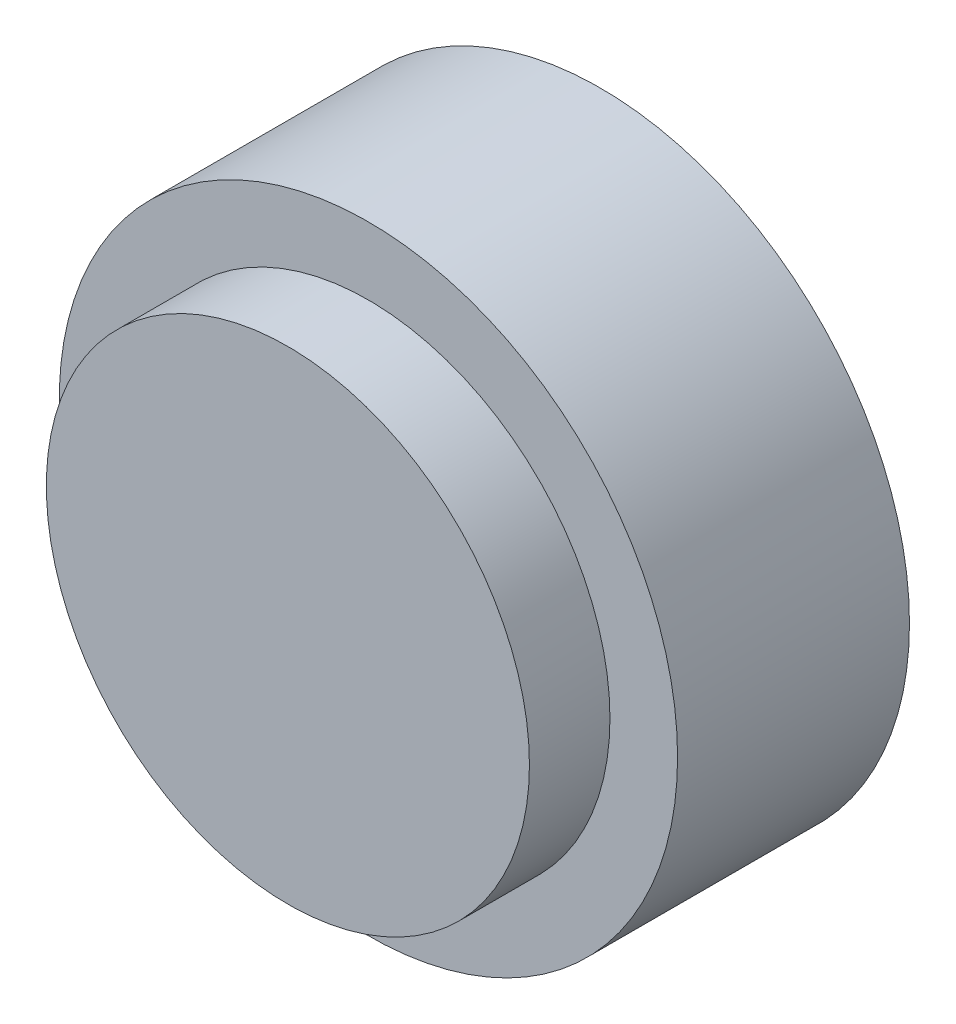
ISO-10303-21;
HEADER;
FILE_DESCRIPTION(('STEP AP214'),'2;1');
FILE_NAME('part.step','',(''),(''),'','','');
FILE_SCHEMA(('AUTOMOTIVE_DESIGN { 1 0 10303 214 1 1 1 1 }'));
ENDSEC;
DATA;
#1=APPLICATION_CONTEXT('core data for automotive mechanical design processes');
#2=APPLICATION_PROTOCOL_DEFINITION('international standard','automotive_design',2000,#1);
#3=PRODUCT_CONTEXT('',#1,'mechanical');
#4=PRODUCT('Part','Part','',(#3));
#5=PRODUCT_RELATED_PRODUCT_CATEGORY('part','',(#4));
#6=PRODUCT_DEFINITION_FORMATION('','',#4);
#7=PRODUCT_DEFINITION_CONTEXT('part definition',#1,'design');
#8=PRODUCT_DEFINITION('design','',#6,#7);
#9=PRODUCT_DEFINITION_SHAPE('','',#8);
#10=(LENGTH_UNIT() NAMED_UNIT(*) SI_UNIT(.MILLI.,.METRE.));
#11=(NAMED_UNIT(*) PLANE_ANGLE_UNIT() SI_UNIT($,.RADIAN.));
#12=(NAMED_UNIT(*) SI_UNIT($,.STERADIAN.) SOLID_ANGLE_UNIT());
#13=UNCERTAINTY_MEASURE_WITH_UNIT(LENGTH_MEASURE(1.E-05),#10,'distance_accuracy_value','');
#14=(GEOMETRIC_REPRESENTATION_CONTEXT(3) GLOBAL_UNCERTAINTY_ASSIGNED_CONTEXT((#13)) GLOBAL_UNIT_ASSIGNED_CONTEXT((#10,
#11,#12)) REPRESENTATION_CONTEXT('',''));
#15=CARTESIAN_POINT('',(0.,0.,0.));
#16=DIRECTION('',(0.,0.,1.));
#17=DIRECTION('',(1.,0.,0.));
#18=AXIS2_PLACEMENT_3D('',#15,#16,#17);
#19=CARTESIAN_POINT('',(0.,0.,12.5));
#20=DIRECTION('',(0.,0.,-1.));
#21=DIRECTION('',(-1.,0.,0.));
#22=AXIS2_PLACEMENT_3D('',#19,#20,#21);
#23=CYLINDRICAL_SURFACE('',#22,37.5);
#24=CARTESIAN_POINT('',(0.,0.,12.5));
#25=DIRECTION('',(0.,0.,1.));
#26=DIRECTION('',(1.,0.,0.));
#27=AXIS2_PLACEMENT_3D('',#24,#25,#26);
#28=CIRCLE('',#27,37.5);
#29=CARTESIAN_POINT('',(37.5,0.,12.5));
#30=VERTEX_POINT('',#29);
#31=EDGE_CURVE('E47',#30,#30,#28,.T.);
#32=ORIENTED_EDGE('',*,*,#31,.F.);
#33=EDGE_LOOP('',(#32));
#34=FACE_BOUND('',#33,.T.);
#35=CARTESIAN_POINT('',(0.,0.,0.));
#36=DIRECTION('',(0.,0.,1.));
#37=DIRECTION('',(1.,0.,0.));
#38=AXIS2_PLACEMENT_3D('',#35,#36,#37);
#39=CIRCLE('',#38,37.5);
#40=CARTESIAN_POINT('',(37.5,0.,0.));
#41=VERTEX_POINT('',#40);
#42=EDGE_CURVE('E159',#41,#41,#39,.T.);
#43=ORIENTED_EDGE('',*,*,#42,.T.);
#44=EDGE_LOOP('',(#43));
#45=FACE_BOUND('',#44,.T.);
#46=ADVANCED_FACE('F40',(#34,#45),#23,.T.);
#47=CARTESIAN_POINT('',(0.,0.,12.5));
#48=DIRECTION('',(0.,0.,1.));
#49=DIRECTION('',(1.,0.,0.));
#50=AXIS2_PLACEMENT_3D('',#47,#48,#49);
#51=PLANE('',#50);
#52=ORIENTED_EDGE('',*,*,#31,.T.);
#53=EDGE_LOOP('',(#52));
#54=FACE_BOUND('',#53,.T.);
#55=ADVANCED_FACE('F166',(#54),#51,.T.);
#56=CARTESIAN_POINT('',(0.,0.,-36.));
#57=DIRECTION('',(0.,0.,1.));
#58=DIRECTION('',(1.,0.,0.));
#59=AXIS2_PLACEMENT_3D('',#56,#57,#58);
#60=CYLINDRICAL_SURFACE('',#59,48.);
#61=CARTESIAN_POINT('',(0.,0.,-36.));
#62=DIRECTION('',(0.,0.,1.));
#63=DIRECTION('',(1.,0.,0.));
#64=AXIS2_PLACEMENT_3D('',#61,#62,#63);
#65=CIRCLE('',#64,48.);
#66=CARTESIAN_POINT('',(48.,0.,-36.));
#67=VERTEX_POINT('',#66);
#68=EDGE_CURVE('E153',#67,#67,#65,.T.);
#69=ORIENTED_EDGE('',*,*,#68,.T.);
#70=EDGE_LOOP('',(#69));
#71=FACE_BOUND('',#70,.T.);
#72=CARTESIAN_POINT('',(0.,0.,0.));
#73=DIRECTION('',(0.,0.,1.));
#74=DIRECTION('',(1.,0.,0.));
#75=AXIS2_PLACEMENT_3D('',#72,#73,#74);
#76=CIRCLE('',#75,48.);
#77=CARTESIAN_POINT('',(48.,0.,0.));
#78=VERTEX_POINT('',#77);
#79=EDGE_CURVE('E152',#78,#78,#76,.T.);
#80=ORIENTED_EDGE('',*,*,#79,.F.);
#81=EDGE_LOOP('',(#80));
#82=FACE_BOUND('',#81,.T.);
#83=ADVANCED_FACE('F180',(#71,#82),#60,.T.);
#84=CARTESIAN_POINT('',(0.,0.,-36.));
#85=DIRECTION('',(0.,0.,1.));
#86=DIRECTION('',(1.,0.,0.));
#87=AXIS2_PLACEMENT_3D('',#84,#85,#86);
#88=CYLINDRICAL_SURFACE('',#87,21.);
#89=CARTESIAN_POINT('',(0.,0.,-36.));
#90=DIRECTION('',(0.,0.,1.));
#91=DIRECTION('',(1.,0.,0.));
#92=AXIS2_PLACEMENT_3D('',#89,#90,#91);
#93=CIRCLE('',#92,21.);
#94=CARTESIAN_POINT('',(21.,0.,-36.));
#95=VERTEX_POINT('',#94);
#96=EDGE_CURVE('E156',#95,#95,#93,.T.);
#97=ORIENTED_EDGE('',*,*,#96,.F.);
#98=EDGE_LOOP('',(#97));
#99=FACE_BOUND('',#98,.T.);
#100=CARTESIAN_POINT('',(0.,0.,0.));
#101=DIRECTION('',(0.,0.,1.));
#102=DIRECTION('',(1.,0.,0.));
#103=AXIS2_PLACEMENT_3D('',#100,#101,#102);
#104=CIRCLE('',#103,21.);
#105=CARTESIAN_POINT('',(21.,0.,0.));
#106=VERTEX_POINT('',#105);
#107=EDGE_CURVE('E11',#106,#106,#104,.T.);
#108=ORIENTED_EDGE('',*,*,#107,.T.);
#109=EDGE_LOOP('',(#108));
#110=FACE_BOUND('',#109,.T.);
#111=ADVANCED_FACE('F182',(#99,#110),#88,.F.);
#112=CARTESIAN_POINT('',(0.,0.,-36.));
#113=DIRECTION('',(0.,0.,1.));
#114=DIRECTION('',(1.,0.,0.));
#115=AXIS2_PLACEMENT_3D('',#112,#113,#114);
#116=PLANE('',#115);
#117=CARTESIAN_POINT('',(0.,42.,-36.));
#118=DIRECTION('',(0.,0.,-1.));
#119=DIRECTION('',(-1.,0.,0.));
#120=AXIS2_PLACEMENT_3D('',#117,#118,#119);
#121=CIRCLE('',#120,2.025);
#122=CARTESIAN_POINT('',(-2.025,42.,-36.));
#123=VERTEX_POINT('',#122);
#124=EDGE_CURVE('E89',#123,#123,#121,.T.);
#125=ORIENTED_EDGE('',*,*,#124,.F.);
#126=EDGE_LOOP('',(#125));
#127=FACE_BOUND('',#126,.T.);
#128=CARTESIAN_POINT('',(-29.6984848098355,29.6984848098363,-36.));
#129=DIRECTION('',(0.,0.,-1.));
#130=DIRECTION('',(-1.,0.,0.));
#131=AXIS2_PLACEMENT_3D('',#128,#129,#130);
#132=CIRCLE('',#131,2.025);
#133=CARTESIAN_POINT('',(-31.7234848098355,29.6984848098363,-36.));
#134=VERTEX_POINT('',#133);
#135=EDGE_CURVE('E82',#134,#134,#132,.T.);
#136=ORIENTED_EDGE('',*,*,#135,.F.);
#137=EDGE_LOOP('',(#136));
#138=FACE_BOUND('',#137,.T.);
#139=CARTESIAN_POINT('',(-42.0000000000018,1.78285241928082E-12,-36.));
#140=DIRECTION('',(0.,0.,-1.));
#141=DIRECTION('',(-1.,0.,0.));
#142=AXIS2_PLACEMENT_3D('',#139,#140,#141);
#143=CIRCLE('',#142,2.025);
#144=CARTESIAN_POINT('',(-44.0250000000018,1.78285241928082E-12,-36.));
#145=VERTEX_POINT('',#144);
#146=EDGE_CURVE('E98',#145,#145,#143,.T.);
#147=ORIENTED_EDGE('',*,*,#146,.F.);
#148=EDGE_LOOP('',(#147));
#149=FACE_BOUND('',#148,.T.);
#150=CARTESIAN_POINT('',(-29.698484809838,-29.6984848098337,-36.));
#151=DIRECTION('',(0.,0.,-1.));
#152=DIRECTION('',(-1.,0.,0.));
#153=AXIS2_PLACEMENT_3D('',#150,#151,#152);
#154=CIRCLE('',#153,2.025);
#155=CARTESIAN_POINT('',(-31.723484809838,-29.6984848098337,-36.));
#156=VERTEX_POINT('',#155);
#157=EDGE_CURVE('E107',#156,#156,#154,.T.);
#158=ORIENTED_EDGE('',*,*,#157,.F.);
#159=EDGE_LOOP('',(#158));
#160=FACE_BOUND('',#159,.T.);
#161=CARTESIAN_POINT('',(-3.56570483856165E-12,-42.,-36.));
#162=DIRECTION('',(0.,0.,-1.));
#163=DIRECTION('',(-1.,0.,0.));
#164=AXIS2_PLACEMENT_3D('',#161,#162,#163);
#165=CIRCLE('',#164,2.025);
#166=CARTESIAN_POINT('',(-2.02500000000357,-42.,-36.));
#167=VERTEX_POINT('',#166);
#168=EDGE_CURVE('E116',#167,#167,#165,.T.);
#169=ORIENTED_EDGE('',*,*,#168,.F.);
#170=EDGE_LOOP('',(#169));
#171=FACE_BOUND('',#170,.T.);
#172=CARTESIAN_POINT('',(29.698484809832,-29.6984848098363,-36.));
#173=DIRECTION('',(0.,0.,-1.));
#174=DIRECTION('',(-1.,0.,0.));
#175=AXIS2_PLACEMENT_3D('',#172,#173,#174);
#176=CIRCLE('',#175,2.025);
#177=CARTESIAN_POINT('',(27.673484809832,-29.6984848098363,-36.));
#178=VERTEX_POINT('',#177);
#179=EDGE_CURVE('E125',#178,#178,#176,.T.);
#180=ORIENTED_EDGE('',*,*,#179,.F.);
#181=EDGE_LOOP('',(#180));
#182=FACE_BOUND('',#181,.T.);
#183=CARTESIAN_POINT('',(41.9999999999982,-1.78799593583724E-12,-36.));
#184=DIRECTION('',(0.,0.,-1.));
#185=DIRECTION('',(-1.,0.,0.));
#186=AXIS2_PLACEMENT_3D('',#183,#184,#185);
#187=CIRCLE('',#186,2.025);
#188=CARTESIAN_POINT('',(39.9749999999982,-1.78799593583724E-12,-36.));
#189=VERTEX_POINT('',#188);
#190=EDGE_CURVE('E134',#189,#189,#187,.T.);
#191=ORIENTED_EDGE('',*,*,#190,.F.);
#192=EDGE_LOOP('',(#191));
#193=FACE_BOUND('',#192,.T.);
#194=CARTESIAN_POINT('',(29.6984848098345,29.6984848098337,-36.));
#195=DIRECTION('',(0.,0.,-1.));
#196=DIRECTION('',(-1.,0.,0.));
#197=AXIS2_PLACEMENT_3D('',#194,#195,#196);
#198=CIRCLE('',#197,2.025);
#199=CARTESIAN_POINT('',(27.6734848098345,29.6984848098337,-36.));
#200=VERTEX_POINT('',#199);
#201=EDGE_CURVE('E143',#200,#200,#198,.T.);
#202=ORIENTED_EDGE('',*,*,#201,.F.);
#203=EDGE_LOOP('',(#202));
#204=FACE_BOUND('',#203,.T.);
#205=ORIENTED_EDGE('',*,*,#68,.F.);
#206=EDGE_LOOP('',(#205));
#207=FACE_BOUND('',#206,.T.);
#208=ORIENTED_EDGE('',*,*,#96,.T.);
#209=EDGE_LOOP('',(#208));
#210=FACE_BOUND('',#209,.T.);
#211=ADVANCED_FACE('F176',(#127,#138,#149,#160,#171,#182,#193,#204,#207,#210),#116,.F.);
#212=CARTESIAN_POINT('',(0.,0.,0.));
#213=DIRECTION('',(0.,0.,1.));
#214=DIRECTION('',(1.,0.,0.));
#215=AXIS2_PLACEMENT_3D('',#212,#213,#214);
#216=PLANE('',#215);
#217=ORIENTED_EDGE('',*,*,#42,.F.);
#218=EDGE_LOOP('',(#217));
#219=FACE_BOUND('',#218,.T.);
#220=ORIENTED_EDGE('',*,*,#79,.T.);
#221=EDGE_LOOP('',(#220));
#222=FACE_BOUND('',#221,.T.);
#223=ADVANCED_FACE('F172',(#219,#222),#216,.T.);
#224=CARTESIAN_POINT('',(0.,0.,0.));
#225=DIRECTION('',(0.,0.,1.));
#226=DIRECTION('',(1.,0.,0.));
#227=AXIS2_PLACEMENT_3D('',#224,#225,#226);
#228=PLANE('',#227);
#229=ORIENTED_EDGE('',*,*,#107,.F.);
#230=EDGE_LOOP('',(#229));
#231=FACE_BOUND('',#230,.T.);
#232=ADVANCED_FACE('F175',(#231),#228,.F.);
#233=CARTESIAN_POINT('',(29.6984848098345,29.6984848098337,-28.));
#234=DIRECTION('',(0.,0.,-1.));
#235=DIRECTION('',(-1.,0.,0.));
#236=AXIS2_PLACEMENT_3D('',#233,#234,#235);
#237=CONICAL_SURFACE('',#236,1.65,1.02974425867665);
#238=CARTESIAN_POINT('',(29.6984848098345,29.6984848098337,-27.0085799786045));
#239=VERTEX_POINT('',#238);
#240=VERTEX_LOOP('',#239);
#241=FACE_BOUND('',#240,.T.);
#242=CARTESIAN_POINT('',(29.6984848098345,29.6984848098337,-28.));
#243=DIRECTION('',(0.,0.,-1.));
#244=DIRECTION('',(-1.,0.,0.));
#245=AXIS2_PLACEMENT_3D('',#242,#243,#244);
#246=CIRCLE('',#245,1.65);
#247=CARTESIAN_POINT('',(28.0484848098345,29.6984848098337,-28.));
#248=VERTEX_POINT('',#247);
#249=EDGE_CURVE('E149',#248,#248,#246,.T.);
#250=ORIENTED_EDGE('',*,*,#249,.T.);
#251=EDGE_LOOP('',(#250));
#252=FACE_BOUND('',#251,.T.);
#253=ADVANCED_FACE('F193',(#241,#252),#237,.F.);
#254=CARTESIAN_POINT('',(29.6984848098345,29.6984848098337,-36.));
#255=DIRECTION('',(0.,0.,-1.));
#256=DIRECTION('',(-1.,0.,0.));
#257=AXIS2_PLACEMENT_3D('',#254,#255,#256);
#258=CYLINDRICAL_SURFACE('',#257,1.65);
#259=ORIENTED_EDGE('',*,*,#249,.F.);
#260=EDGE_LOOP('',(#259));
#261=FACE_BOUND('',#260,.T.);
#262=CARTESIAN_POINT('',(29.6984848098345,29.6984848098337,-35.625));
#263=DIRECTION('',(0.,0.,-1.));
#264=DIRECTION('',(-1.,0.,0.));
#265=AXIS2_PLACEMENT_3D('',#262,#263,#264);
#266=CIRCLE('',#265,1.65);
#267=CARTESIAN_POINT('',(28.0484848098345,29.6984848098337,-35.625));
#268=VERTEX_POINT('',#267);
#269=EDGE_CURVE('E146',#268,#268,#266,.T.);
#270=ORIENTED_EDGE('',*,*,#269,.T.);
#271=EDGE_LOOP('',(#270));
#272=FACE_BOUND('',#271,.T.);
#273=ADVANCED_FACE('F198',(#261,#272),#258,.F.);
#274=CARTESIAN_POINT('',(29.6984848098345,29.6984848098337,-36.));
#275=DIRECTION('',(0.,0.,-1.));
#276=DIRECTION('',(-1.,0.,0.));
#277=AXIS2_PLACEMENT_3D('',#274,#275,#276);
#278=CONICAL_SURFACE('',#277,2.025,0.785398163397458);
#279=ORIENTED_EDGE('',*,*,#269,.F.);
#280=EDGE_LOOP('',(#279));
#281=FACE_BOUND('',#280,.T.);
#282=ORIENTED_EDGE('',*,*,#201,.T.);
#283=EDGE_LOOP('',(#282));
#284=FACE_BOUND('',#283,.T.);
#285=ADVANCED_FACE('F205',(#281,#284),#278,.F.);
#286=CARTESIAN_POINT('',(41.9999999999982,-1.78799593583724E-12,-28.));
#287=DIRECTION('',(0.,0.,-1.));
#288=DIRECTION('',(-1.,0.,0.));
#289=AXIS2_PLACEMENT_3D('',#286,#287,#288);
#290=CONICAL_SURFACE('',#289,1.65,1.02974425867665);
#291=CARTESIAN_POINT('',(41.9999999999982,-1.78799593583724E-12,-27.0085799786045));
#292=VERTEX_POINT('',#291);
#293=VERTEX_LOOP('',#292);
#294=FACE_BOUND('',#293,.T.);
#295=CARTESIAN_POINT('',(41.9999999999982,-1.78799593583724E-12,-28.));
#296=DIRECTION('',(0.,0.,-1.));
#297=DIRECTION('',(-1.,0.,0.));
#298=AXIS2_PLACEMENT_3D('',#295,#296,#297);
#299=CIRCLE('',#298,1.65);
#300=CARTESIAN_POINT('',(40.3499999999982,-1.78799593583724E-12,-28.));
#301=VERTEX_POINT('',#300);
#302=EDGE_CURVE('E140',#301,#301,#299,.T.);
#303=ORIENTED_EDGE('',*,*,#302,.T.);
#304=EDGE_LOOP('',(#303));
#305=FACE_BOUND('',#304,.T.);
#306=ADVANCED_FACE('F237',(#294,#305),#290,.F.);
#307=CARTESIAN_POINT('',(41.9999999999982,-1.78799593583724E-12,-36.));
#308=DIRECTION('',(0.,0.,-1.));
#309=DIRECTION('',(-1.,0.,0.));
#310=AXIS2_PLACEMENT_3D('',#307,#308,#309);
#311=CYLINDRICAL_SURFACE('',#310,1.65);
#312=ORIENTED_EDGE('',*,*,#302,.F.);
#313=EDGE_LOOP('',(#312));
#314=FACE_BOUND('',#313,.T.);
#315=CARTESIAN_POINT('',(41.9999999999982,-1.78799593583724E-12,-35.625));
#316=DIRECTION('',(0.,0.,-1.));
#317=DIRECTION('',(-1.,0.,0.));
#318=AXIS2_PLACEMENT_3D('',#315,#316,#317);
#319=CIRCLE('',#318,1.65);
#320=CARTESIAN_POINT('',(40.3499999999982,-1.78799593583724E-12,-35.625));
#321=VERTEX_POINT('',#320);
#322=EDGE_CURVE('E137',#321,#321,#319,.T.);
#323=ORIENTED_EDGE('',*,*,#322,.T.);
#324=EDGE_LOOP('',(#323));
#325=FACE_BOUND('',#324,.T.);
#326=ADVANCED_FACE('F242',(#314,#325),#311,.F.);
#327=CARTESIAN_POINT('',(41.9999999999982,-1.78799593583724E-12,-36.));
#328=DIRECTION('',(0.,0.,-1.));
#329=DIRECTION('',(-1.,0.,0.));
#330=AXIS2_PLACEMENT_3D('',#327,#328,#329);
#331=CONICAL_SURFACE('',#330,2.025,0.785398163397448);
#332=ORIENTED_EDGE('',*,*,#322,.F.);
#333=EDGE_LOOP('',(#332));
#334=FACE_BOUND('',#333,.T.);
#335=ORIENTED_EDGE('',*,*,#190,.T.);
#336=EDGE_LOOP('',(#335));
#337=FACE_BOUND('',#336,.T.);
#338=ADVANCED_FACE('F248',(#334,#337),#331,.F.);
#339=CARTESIAN_POINT('',(29.698484809832,-29.6984848098363,-28.));
#340=DIRECTION('',(0.,0.,-1.));
#341=DIRECTION('',(-1.,0.,0.));
#342=AXIS2_PLACEMENT_3D('',#339,#340,#341);
#343=CONICAL_SURFACE('',#342,1.65,1.02974425867665);
#344=CARTESIAN_POINT('',(29.698484809832,-29.6984848098363,-27.0085799786045));
#345=VERTEX_POINT('',#344);
#346=VERTEX_LOOP('',#345);
#347=FACE_BOUND('',#346,.T.);
#348=CARTESIAN_POINT('',(29.698484809832,-29.6984848098363,-28.));
#349=DIRECTION('',(0.,0.,-1.));
#350=DIRECTION('',(-1.,0.,0.));
#351=AXIS2_PLACEMENT_3D('',#348,#349,#350);
#352=CIRCLE('',#351,1.65);
#353=CARTESIAN_POINT('',(28.048484809832,-29.6984848098363,-28.));
#354=VERTEX_POINT('',#353);
#355=EDGE_CURVE('E131',#354,#354,#352,.T.);
#356=ORIENTED_EDGE('',*,*,#355,.T.);
#357=EDGE_LOOP('',(#356));
#358=FACE_BOUND('',#357,.T.);
#359=ADVANCED_FACE('F252',(#347,#358),#343,.F.);
#360=CARTESIAN_POINT('',(29.698484809832,-29.6984848098363,-36.));
#361=DIRECTION('',(0.,0.,-1.));
#362=DIRECTION('',(-1.,0.,0.));
#363=AXIS2_PLACEMENT_3D('',#360,#361,#362);
#364=CYLINDRICAL_SURFACE('',#363,1.65);
#365=ORIENTED_EDGE('',*,*,#355,.F.);
#366=EDGE_LOOP('',(#365));
#367=FACE_BOUND('',#366,.T.);
#368=CARTESIAN_POINT('',(29.698484809832,-29.6984848098363,-35.625));
#369=DIRECTION('',(0.,0.,-1.));
#370=DIRECTION('',(-1.,0.,0.));
#371=AXIS2_PLACEMENT_3D('',#368,#369,#370);
#372=CIRCLE('',#371,1.65);
#373=CARTESIAN_POINT('',(28.048484809832,-29.6984848098363,-35.625));
#374=VERTEX_POINT('',#373);
#375=EDGE_CURVE('E128',#374,#374,#372,.T.);
#376=ORIENTED_EDGE('',*,*,#375,.T.);
#377=EDGE_LOOP('',(#376));
#378=FACE_BOUND('',#377,.T.);
#379=ADVANCED_FACE('F256',(#367,#378),#364,.F.);
#380=CARTESIAN_POINT('',(29.698484809832,-29.6984848098363,-36.));
#381=DIRECTION('',(0.,0.,-1.));
#382=DIRECTION('',(-1.,0.,0.));
#383=AXIS2_PLACEMENT_3D('',#380,#381,#382);
#384=CONICAL_SURFACE('',#383,2.025,0.785398163397448);
#385=ORIENTED_EDGE('',*,*,#375,.F.);
#386=EDGE_LOOP('',(#385));
#387=FACE_BOUND('',#386,.T.);
#388=ORIENTED_EDGE('',*,*,#179,.T.);
#389=EDGE_LOOP('',(#388));
#390=FACE_BOUND('',#389,.T.);
#391=ADVANCED_FACE('F260',(#387,#390),#384,.F.);
#392=CARTESIAN_POINT('',(-3.56570483856165E-12,-42.,-28.));
#393=DIRECTION('',(0.,0.,-1.));
#394=DIRECTION('',(-1.,0.,0.));
#395=AXIS2_PLACEMENT_3D('',#392,#393,#394);
#396=CONICAL_SURFACE('',#395,1.65,1.02974425867665);
#397=CARTESIAN_POINT('',(-3.56790710131145E-12,-42.,-27.0085799786045));
#398=VERTEX_POINT('',#397);
#399=VERTEX_LOOP('',#398);
#400=FACE_BOUND('',#399,.T.);
#401=CARTESIAN_POINT('',(-3.56570483856165E-12,-42.,-28.));
#402=DIRECTION('',(0.,0.,-1.));
#403=DIRECTION('',(-1.,0.,0.));
#404=AXIS2_PLACEMENT_3D('',#401,#402,#403);
#405=CIRCLE('',#404,1.65);
#406=CARTESIAN_POINT('',(-1.65000000000356,-42.,-28.));
#407=VERTEX_POINT('',#406);
#408=EDGE_CURVE('E122',#407,#407,#405,.T.);
#409=ORIENTED_EDGE('',*,*,#408,.T.);
#410=EDGE_LOOP('',(#409));
#411=FACE_BOUND('',#410,.T.);
#412=ADVANCED_FACE('F264',(#400,#411),#396,.F.);
#413=CARTESIAN_POINT('',(-3.56570483856165E-12,-42.,-36.));
#414=DIRECTION('',(0.,0.,-1.));
#415=DIRECTION('',(-1.,0.,0.));
#416=AXIS2_PLACEMENT_3D('',#413,#414,#415);
#417=CYLINDRICAL_SURFACE('',#416,1.65);
#418=ORIENTED_EDGE('',*,*,#408,.F.);
#419=EDGE_LOOP('',(#418));
#420=FACE_BOUND('',#419,.T.);
#421=CARTESIAN_POINT('',(-3.56570483856165E-12,-42.,-35.625));
#422=DIRECTION('',(0.,0.,-1.));
#423=DIRECTION('',(-1.,0.,0.));
#424=AXIS2_PLACEMENT_3D('',#421,#422,#423);
#425=CIRCLE('',#424,1.65);
#426=CARTESIAN_POINT('',(-1.65000000000356,-42.,-35.625));
#427=VERTEX_POINT('',#426);
#428=EDGE_CURVE('E119',#427,#427,#425,.T.);
#429=ORIENTED_EDGE('',*,*,#428,.T.);
#430=EDGE_LOOP('',(#429));
#431=FACE_BOUND('',#430,.T.);
#432=ADVANCED_FACE('F268',(#420,#431),#417,.F.);
#433=CARTESIAN_POINT('',(-3.56570483856165E-12,-42.,-36.));
#434=DIRECTION('',(0.,0.,-1.));
#435=DIRECTION('',(-1.,0.,0.));
#436=AXIS2_PLACEMENT_3D('',#433,#434,#435);
#437=CONICAL_SURFACE('',#436,2.025,0.78539816339745);
#438=ORIENTED_EDGE('',*,*,#428,.F.);
#439=EDGE_LOOP('',(#438));
#440=FACE_BOUND('',#439,.T.);
#441=ORIENTED_EDGE('',*,*,#168,.T.);
#442=EDGE_LOOP('',(#441));
#443=FACE_BOUND('',#442,.T.);
#444=ADVANCED_FACE('F272',(#440,#443),#437,.F.);
#445=CARTESIAN_POINT('',(-29.698484809838,-29.6984848098337,-28.));
#446=DIRECTION('',(0.,0.,-1.));
#447=DIRECTION('',(-1.,0.,0.));
#448=AXIS2_PLACEMENT_3D('',#445,#446,#447);
#449=CONICAL_SURFACE('',#448,1.65,1.02974425867665);
#450=CARTESIAN_POINT('',(-29.698484809838,-29.6984848098337,-27.0085799786045));
#451=VERTEX_POINT('',#450);
#452=VERTEX_LOOP('',#451);
#453=FACE_BOUND('',#452,.T.);
#454=CARTESIAN_POINT('',(-29.698484809838,-29.6984848098337,-28.));
#455=DIRECTION('',(0.,0.,-1.));
#456=DIRECTION('',(-1.,0.,0.));
#457=AXIS2_PLACEMENT_3D('',#454,#455,#456);
#458=CIRCLE('',#457,1.65);
#459=CARTESIAN_POINT('',(-31.348484809838,-29.6984848098337,-28.));
#460=VERTEX_POINT('',#459);
#461=EDGE_CURVE('E113',#460,#460,#458,.T.);
#462=ORIENTED_EDGE('',*,*,#461,.T.);
#463=EDGE_LOOP('',(#462));
#464=FACE_BOUND('',#463,.T.);
#465=ADVANCED_FACE('F276',(#453,#464),#449,.F.);
#466=CARTESIAN_POINT('',(-29.698484809838,-29.6984848098337,-36.));
#467=DIRECTION('',(0.,0.,-1.));
#468=DIRECTION('',(-1.,0.,0.));
#469=AXIS2_PLACEMENT_3D('',#466,#467,#468);
#470=CYLINDRICAL_SURFACE('',#469,1.65);
#471=ORIENTED_EDGE('',*,*,#461,.F.);
#472=EDGE_LOOP('',(#471));
#473=FACE_BOUND('',#472,.T.);
#474=CARTESIAN_POINT('',(-29.698484809838,-29.6984848098337,-35.625));
#475=DIRECTION('',(0.,0.,-1.));
#476=DIRECTION('',(-1.,0.,0.));
#477=AXIS2_PLACEMENT_3D('',#474,#475,#476);
#478=CIRCLE('',#477,1.65);
#479=CARTESIAN_POINT('',(-31.348484809838,-29.6984848098337,-35.625));
#480=VERTEX_POINT('',#479);
#481=EDGE_CURVE('E110',#480,#480,#478,.T.);
#482=ORIENTED_EDGE('',*,*,#481,.T.);
#483=EDGE_LOOP('',(#482));
#484=FACE_BOUND('',#483,.T.);
#485=ADVANCED_FACE('F280',(#473,#484),#470,.F.);
#486=CARTESIAN_POINT('',(-29.698484809838,-29.6984848098337,-36.));
#487=DIRECTION('',(0.,0.,-1.));
#488=DIRECTION('',(-1.,0.,0.));
#489=AXIS2_PLACEMENT_3D('',#486,#487,#488);
#490=CONICAL_SURFACE('',#489,2.025,0.785398163397448);
#491=ORIENTED_EDGE('',*,*,#481,.F.);
#492=EDGE_LOOP('',(#491));
#493=FACE_BOUND('',#492,.T.);
#494=ORIENTED_EDGE('',*,*,#157,.T.);
#495=EDGE_LOOP('',(#494));
#496=FACE_BOUND('',#495,.T.);
#497=ADVANCED_FACE('F284',(#493,#496),#490,.F.);
#498=CARTESIAN_POINT('',(-42.0000000000018,1.78285241928082E-12,-28.));
#499=DIRECTION('',(0.,0.,-1.));
#500=DIRECTION('',(-1.,0.,0.));
#501=AXIS2_PLACEMENT_3D('',#498,#499,#500);
#502=CONICAL_SURFACE('',#501,1.65,1.02974425867665);
#503=CARTESIAN_POINT('',(-42.0000000000018,1.78285241928082E-12,-27.0085799786045));
#504=VERTEX_POINT('',#503);
#505=VERTEX_LOOP('',#504);
#506=FACE_BOUND('',#505,.T.);
#507=CARTESIAN_POINT('',(-42.0000000000018,1.78285241928082E-12,-28.));
#508=DIRECTION('',(0.,0.,-1.));
#509=DIRECTION('',(-1.,0.,0.));
#510=AXIS2_PLACEMENT_3D('',#507,#508,#509);
#511=CIRCLE('',#510,1.65);
#512=CARTESIAN_POINT('',(-43.6500000000018,1.78285241928082E-12,-28.));
#513=VERTEX_POINT('',#512);
#514=EDGE_CURVE('E104',#513,#513,#511,.T.);
#515=ORIENTED_EDGE('',*,*,#514,.T.);
#516=EDGE_LOOP('',(#515));
#517=FACE_BOUND('',#516,.T.);
#518=ADVANCED_FACE('F288',(#506,#517),#502,.F.);
#519=CARTESIAN_POINT('',(-42.0000000000018,1.78285241928082E-12,-36.));
#520=DIRECTION('',(0.,0.,-1.));
#521=DIRECTION('',(-1.,0.,0.));
#522=AXIS2_PLACEMENT_3D('',#519,#520,#521);
#523=CYLINDRICAL_SURFACE('',#522,1.65);
#524=ORIENTED_EDGE('',*,*,#514,.F.);
#525=EDGE_LOOP('',(#524));
#526=FACE_BOUND('',#525,.T.);
#527=CARTESIAN_POINT('',(-42.0000000000018,1.78285241928082E-12,-35.625));
#528=DIRECTION('',(0.,0.,-1.));
#529=DIRECTION('',(-1.,0.,0.));
#530=AXIS2_PLACEMENT_3D('',#527,#528,#529);
#531=CIRCLE('',#530,1.65);
#532=CARTESIAN_POINT('',(-43.6500000000018,1.78285241928082E-12,-35.625));
#533=VERTEX_POINT('',#532);
#534=EDGE_CURVE('E101',#533,#533,#531,.T.);
#535=ORIENTED_EDGE('',*,*,#534,.T.);
#536=EDGE_LOOP('',(#535));
#537=FACE_BOUND('',#536,.T.);
#538=ADVANCED_FACE('F292',(#526,#537),#523,.F.);
#539=CARTESIAN_POINT('',(-42.0000000000018,1.78285241928082E-12,-36.));
#540=DIRECTION('',(0.,0.,-1.));
#541=DIRECTION('',(-1.,0.,0.));
#542=AXIS2_PLACEMENT_3D('',#539,#540,#541);
#543=CONICAL_SURFACE('',#542,2.025,0.785398163397448);
#544=ORIENTED_EDGE('',*,*,#534,.F.);
#545=EDGE_LOOP('',(#544));
#546=FACE_BOUND('',#545,.T.);
#547=ORIENTED_EDGE('',*,*,#146,.T.);
#548=EDGE_LOOP('',(#547));
#549=FACE_BOUND('',#548,.T.);
#550=ADVANCED_FACE('F296',(#546,#549),#543,.F.);
#551=CARTESIAN_POINT('',(-29.6984848098355,29.6984848098363,-28.));
#552=DIRECTION('',(0.,0.,-1.));
#553=DIRECTION('',(-1.,0.,0.));
#554=AXIS2_PLACEMENT_3D('',#551,#552,#553);
#555=CONICAL_SURFACE('',#554,1.65,1.02974425867665);
#556=CARTESIAN_POINT('',(-29.6984848098355,29.6984848098363,-27.0085799786045));
#557=VERTEX_POINT('',#556);
#558=VERTEX_LOOP('',#557);
#559=FACE_BOUND('',#558,.T.);
#560=CARTESIAN_POINT('',(-29.6984848098355,29.6984848098363,-28.));
#561=DIRECTION('',(0.,0.,-1.));
#562=DIRECTION('',(-1.,0.,0.));
#563=AXIS2_PLACEMENT_3D('',#560,#561,#562);
#564=CIRCLE('',#563,1.65);
#565=CARTESIAN_POINT('',(-31.3484848098355,29.6984848098363,-28.));
#566=VERTEX_POINT('',#565);
#567=EDGE_CURVE('E95',#566,#566,#564,.T.);
#568=ORIENTED_EDGE('',*,*,#567,.T.);
#569=EDGE_LOOP('',(#568));
#570=FACE_BOUND('',#569,.T.);
#571=ADVANCED_FACE('F300',(#559,#570),#555,.F.);
#572=CARTESIAN_POINT('',(-29.6984848098355,29.6984848098363,-36.));
#573=DIRECTION('',(0.,0.,-1.));
#574=DIRECTION('',(-1.,0.,0.));
#575=AXIS2_PLACEMENT_3D('',#572,#573,#574);
#576=CYLINDRICAL_SURFACE('',#575,1.65);
#577=ORIENTED_EDGE('',*,*,#567,.F.);
#578=EDGE_LOOP('',(#577));
#579=FACE_BOUND('',#578,.T.);
#580=CARTESIAN_POINT('',(-29.6984848098355,29.6984848098363,-35.625));
#581=DIRECTION('',(0.,0.,-1.));
#582=DIRECTION('',(-1.,0.,0.));
#583=AXIS2_PLACEMENT_3D('',#580,#581,#582);
#584=CIRCLE('',#583,1.65);
#585=CARTESIAN_POINT('',(-31.3484848098355,29.6984848098363,-35.625));
#586=VERTEX_POINT('',#585);
#587=EDGE_CURVE('E86',#586,#586,#584,.T.);
#588=ORIENTED_EDGE('',*,*,#587,.T.);
#589=EDGE_LOOP('',(#588));
#590=FACE_BOUND('',#589,.T.);
#591=ADVANCED_FACE('F304',(#579,#590),#576,.F.);
#592=CARTESIAN_POINT('',(-29.6984848098355,29.6984848098363,-36.));
#593=DIRECTION('',(0.,0.,-1.));
#594=DIRECTION('',(-1.,0.,0.));
#595=AXIS2_PLACEMENT_3D('',#592,#593,#594);
#596=CONICAL_SURFACE('',#595,2.025,0.785398163397448);
#597=ORIENTED_EDGE('',*,*,#587,.F.);
#598=EDGE_LOOP('',(#597));
#599=FACE_BOUND('',#598,.T.);
#600=ORIENTED_EDGE('',*,*,#135,.T.);
#601=EDGE_LOOP('',(#600));
#602=FACE_BOUND('',#601,.T.);
#603=ADVANCED_FACE('F76',(#599,#602),#596,.F.);
#604=CARTESIAN_POINT('',(0.,42.,-28.));
#605=DIRECTION('',(0.,0.,-1.));
#606=DIRECTION('',(-1.,0.,0.));
#607=AXIS2_PLACEMENT_3D('',#604,#605,#606);
#608=CONICAL_SURFACE('',#607,1.65,1.02974425867665);
#609=CARTESIAN_POINT('',(0.,42.,-27.0085799786045));
#610=VERTEX_POINT('',#609);
#611=VERTEX_LOOP('',#610);
#612=FACE_BOUND('',#611,.T.);
#613=CARTESIAN_POINT('',(0.,42.,-28.));
#614=DIRECTION('',(0.,0.,-1.));
#615=DIRECTION('',(-1.,0.,0.));
#616=AXIS2_PLACEMENT_3D('',#613,#614,#615);
#617=CIRCLE('',#616,1.65);
#618=CARTESIAN_POINT('',(-1.65,42.,-28.));
#619=VERTEX_POINT('',#618);
#620=EDGE_CURVE('E80',#619,#619,#617,.T.);
#621=ORIENTED_EDGE('',*,*,#620,.T.);
#622=EDGE_LOOP('',(#621));
#623=FACE_BOUND('',#622,.T.);
#624=ADVANCED_FACE('F72',(#612,#623),#608,.F.);
#625=CARTESIAN_POINT('',(0.,42.,-36.));
#626=DIRECTION('',(0.,0.,-1.));
#627=DIRECTION('',(-1.,0.,0.));
#628=AXIS2_PLACEMENT_3D('',#625,#626,#627);
#629=CYLINDRICAL_SURFACE('',#628,1.65);
#630=ORIENTED_EDGE('',*,*,#620,.F.);
#631=EDGE_LOOP('',(#630));
#632=FACE_BOUND('',#631,.T.);
#633=CARTESIAN_POINT('',(0.,42.,-35.625));
#634=DIRECTION('',(0.,0.,-1.));
#635=DIRECTION('',(-1.,0.,0.));
#636=AXIS2_PLACEMENT_3D('',#633,#634,#635);
#637=CIRCLE('',#636,1.65);
#638=CARTESIAN_POINT('',(-1.65,42.,-35.625));
#639=VERTEX_POINT('',#638);
#640=EDGE_CURVE('E83',#639,#639,#637,.T.);
#641=ORIENTED_EDGE('',*,*,#640,.T.);
#642=EDGE_LOOP('',(#641));
#643=FACE_BOUND('',#642,.T.);
#644=ADVANCED_FACE('F75',(#632,#643),#629,.F.);
#645=CARTESIAN_POINT('',(0.,42.,-36.));
#646=DIRECTION('',(0.,0.,-1.));
#647=DIRECTION('',(-1.,0.,0.));
#648=AXIS2_PLACEMENT_3D('',#645,#646,#647);
#649=CONICAL_SURFACE('',#648,2.025,0.78539816339745);
#650=ORIENTED_EDGE('',*,*,#640,.F.);
#651=EDGE_LOOP('',(#650));
#652=FACE_BOUND('',#651,.T.);
#653=ORIENTED_EDGE('',*,*,#124,.T.);
#654=EDGE_LOOP('',(#653));
#655=FACE_BOUND('',#654,.T.);
#656=ADVANCED_FACE('F314',(#652,#655),#649,.F.);
#657=CLOSED_SHELL('',(#46,#55,#83,#111,#211,#223,#232,#253,#273,#285,#306,#326,#338,#359,#379,
#391,#412,#432,#444,#465,#485,#497,#518,#538,#550,#571,#591,#603,#624,#644,#656));
#658=MANIFOLD_SOLID_BREP('B2',#657);
#659=ADVANCED_BREP_SHAPE_REPRESENTATION('',(#18,#658),#14);
#660=SHAPE_DEFINITION_REPRESENTATION(#9,#659);
ENDSEC;
END-ISO-10303-21;
